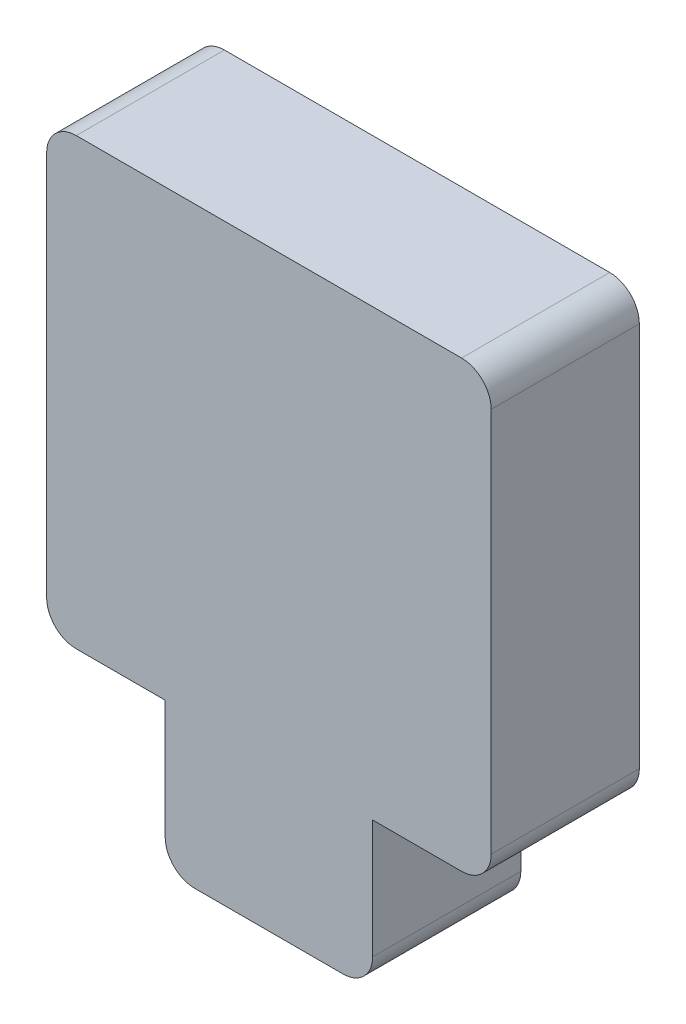
ISO-10303-21;
HEADER;
FILE_DESCRIPTION(('STEP AP214'),'2;1');
FILE_NAME('part.step','',(''),(''),'','','');
FILE_SCHEMA(('AUTOMOTIVE_DESIGN { 1 0 10303 214 1 1 1 1 }'));
ENDSEC;
DATA;
#1=APPLICATION_CONTEXT('core data for automotive mechanical design processes');
#2=APPLICATION_PROTOCOL_DEFINITION('international standard','automotive_design',2000,#1);
#3=PRODUCT_CONTEXT('',#1,'mechanical');
#4=PRODUCT('Part','Part','',(#3));
#5=PRODUCT_RELATED_PRODUCT_CATEGORY('part','',(#4));
#6=PRODUCT_DEFINITION_FORMATION('','',#4);
#7=PRODUCT_DEFINITION_CONTEXT('part definition',#1,'design');
#8=PRODUCT_DEFINITION('design','',#6,#7);
#9=PRODUCT_DEFINITION_SHAPE('','',#8);
#10=(LENGTH_UNIT() NAMED_UNIT(*) SI_UNIT(.MILLI.,.METRE.));
#11=(NAMED_UNIT(*) PLANE_ANGLE_UNIT() SI_UNIT($,.RADIAN.));
#12=(NAMED_UNIT(*) SI_UNIT($,.STERADIAN.) SOLID_ANGLE_UNIT());
#13=UNCERTAINTY_MEASURE_WITH_UNIT(LENGTH_MEASURE(1.E-05),#10,'distance_accuracy_value','');
#14=(GEOMETRIC_REPRESENTATION_CONTEXT(3) GLOBAL_UNCERTAINTY_ASSIGNED_CONTEXT((#13)) GLOBAL_UNIT_ASSIGNED_CONTEXT((#10,
#11,#12)) REPRESENTATION_CONTEXT('',''));
#15=CARTESIAN_POINT('',(0.,0.,0.));
#16=DIRECTION('',(0.,0.,1.));
#17=DIRECTION('',(1.,0.,0.));
#18=AXIS2_PLACEMENT_3D('',#15,#16,#17);
#19=CARTESIAN_POINT('',(-15.,30.,10.));
#20=DIRECTION('',(0.,1.,0.));
#21=DIRECTION('',(0.,0.,1.));
#22=AXIS2_PLACEMENT_3D('',#19,#20,#21);
#23=PLANE('',#22);
#24=DIRECTION('',(1.,0.,0.));
#25=VECTOR('',#24,1.);
#26=CARTESIAN_POINT('',(-15.,30.,10.));
#27=LINE('',#26,#25);
#28=CARTESIAN_POINT('',(-13.,30.,10.));
#29=VERTEX_POINT('',#28);
#30=CARTESIAN_POINT('',(13.,30.,10.));
#31=VERTEX_POINT('',#30);
#32=EDGE_CURVE('E227',#29,#31,#27,.T.);
#33=ORIENTED_EDGE('',*,*,#32,.T.);
#34=DIRECTION('',(0.,0.,-1.));
#35=VECTOR('',#34,1.);
#36=CARTESIAN_POINT('',(13.,30.,10.));
#37=LINE('',#36,#35);
#38=CARTESIAN_POINT('',(13.,30.,0.));
#39=VERTEX_POINT('',#38);
#40=EDGE_CURVE('E11',#31,#39,#37,.T.);
#41=ORIENTED_EDGE('',*,*,#40,.T.);
#42=DIRECTION('',(1.,0.,0.));
#43=VECTOR('',#42,1.);
#44=CARTESIAN_POINT('',(-15.,30.,0.));
#45=LINE('',#44,#43);
#46=CARTESIAN_POINT('',(-13.,30.,0.));
#47=VERTEX_POINT('',#46);
#48=EDGE_CURVE('E232',#47,#39,#45,.T.);
#49=ORIENTED_EDGE('',*,*,#48,.F.);
#50=DIRECTION('',(0.,0.,-1.));
#51=VECTOR('',#50,1.);
#52=CARTESIAN_POINT('',(-13.,30.,10.));
#53=LINE('',#52,#51);
#54=EDGE_CURVE('E50',#47,#29,#53,.F.);
#55=ORIENTED_EDGE('',*,*,#54,.T.);
#56=EDGE_LOOP('',(#33,#41,#49,#55));
#57=FACE_BOUND('',#56,.T.);
#58=ADVANCED_FACE('F39',(#57),#23,.T.);
#59=CARTESIAN_POINT('',(-15.,30.,10.));
#60=DIRECTION('',(1.,0.,0.));
#61=DIRECTION('',(0.,1.,0.));
#62=AXIS2_PLACEMENT_3D('',#59,#60,#61);
#63=PLANE('',#62);
#64=DIRECTION('',(0.,-1.,0.));
#65=VECTOR('',#64,1.);
#66=CARTESIAN_POINT('',(-15.,30.,0.));
#67=LINE('',#66,#65);
#68=CARTESIAN_POINT('',(-15.,28.,0.));
#69=VERTEX_POINT('',#68);
#70=CARTESIAN_POINT('',(-15.,2.,0.));
#71=VERTEX_POINT('',#70);
#72=EDGE_CURVE('E241',#69,#71,#67,.T.);
#73=ORIENTED_EDGE('',*,*,#72,.T.);
#74=DIRECTION('',(0.,0.,-1.));
#75=VECTOR('',#74,1.);
#76=CARTESIAN_POINT('',(-15.,2.,10.));
#77=LINE('',#76,#75);
#78=CARTESIAN_POINT('',(-15.,2.,10.));
#79=VERTEX_POINT('',#78);
#80=EDGE_CURVE('E53',#71,#79,#77,.F.);
#81=ORIENTED_EDGE('',*,*,#80,.T.);
#82=DIRECTION('',(0.,-1.,0.));
#83=VECTOR('',#82,1.);
#84=CARTESIAN_POINT('',(-15.,30.,10.));
#85=LINE('',#84,#83);
#86=CARTESIAN_POINT('',(-15.,28.,10.));
#87=VERTEX_POINT('',#86);
#88=EDGE_CURVE('E182',#87,#79,#85,.T.);
#89=ORIENTED_EDGE('',*,*,#88,.F.);
#90=DIRECTION('',(0.,0.,-1.));
#91=VECTOR('',#90,1.);
#92=CARTESIAN_POINT('',(-15.,28.,0.));
#93=LINE('',#92,#91);
#94=EDGE_CURVE('E212',#87,#69,#93,.T.);
#95=ORIENTED_EDGE('',*,*,#94,.T.);
#96=EDGE_LOOP('',(#73,#81,#89,#95));
#97=FACE_BOUND('',#96,.T.);
#98=ADVANCED_FACE('F238',(#97),#63,.F.);
#99=CARTESIAN_POINT('',(15.,30.,10.));
#100=DIRECTION('',(1.,0.,0.));
#101=DIRECTION('',(0.,1.,0.));
#102=AXIS2_PLACEMENT_3D('',#99,#100,#101);
#103=PLANE('',#102);
#104=DIRECTION('',(0.,-1.,0.));
#105=VECTOR('',#104,1.);
#106=CARTESIAN_POINT('',(15.,30.,10.));
#107=LINE('',#106,#105);
#108=CARTESIAN_POINT('',(15.,28.,10.));
#109=VERTEX_POINT('',#108);
#110=CARTESIAN_POINT('',(15.,2.,10.));
#111=VERTEX_POINT('',#110);
#112=EDGE_CURVE('E237',#109,#111,#107,.T.);
#113=ORIENTED_EDGE('',*,*,#112,.T.);
#114=DIRECTION('',(0.,0.,-1.));
#115=VECTOR('',#114,1.);
#116=CARTESIAN_POINT('',(15.,2.,0.));
#117=LINE('',#116,#115);
#118=CARTESIAN_POINT('',(15.,2.,0.));
#119=VERTEX_POINT('',#118);
#120=EDGE_CURVE('E219',#111,#119,#117,.T.);
#121=ORIENTED_EDGE('',*,*,#120,.T.);
#122=DIRECTION('',(0.,-1.,0.));
#123=VECTOR('',#122,1.);
#124=CARTESIAN_POINT('',(15.,30.,0.));
#125=LINE('',#124,#123);
#126=CARTESIAN_POINT('',(15.,28.,0.));
#127=VERTEX_POINT('',#126);
#128=EDGE_CURVE('E153',#127,#119,#125,.T.);
#129=ORIENTED_EDGE('',*,*,#128,.F.);
#130=DIRECTION('',(0.,0.,-1.));
#131=VECTOR('',#130,1.);
#132=CARTESIAN_POINT('',(15.,28.,10.));
#133=LINE('',#132,#131);
#134=EDGE_CURVE('E217',#127,#109,#133,.F.);
#135=ORIENTED_EDGE('',*,*,#134,.T.);
#136=EDGE_LOOP('',(#113,#121,#129,#135));
#137=FACE_BOUND('',#136,.T.);
#138=ADVANCED_FACE('F278',(#137),#103,.T.);
#139=CARTESIAN_POINT('',(0.,0.,0.));
#140=DIRECTION('',(0.,0.,-1.));
#141=DIRECTION('',(-1.,0.,0.));
#142=AXIS2_PLACEMENT_3D('',#139,#140,#141);
#143=PLANE('',#142);
#144=DIRECTION('',(0.,-1.,0.));
#145=VECTOR('',#144,1.);
#146=CARTESIAN_POINT('',(7.,0.,0.));
#147=LINE('',#146,#145);
#148=CARTESIAN_POINT('',(7.,0.,0.));
#149=VERTEX_POINT('',#148);
#150=CARTESIAN_POINT('',(7.,-8.,0.));
#151=VERTEX_POINT('',#150);
#152=EDGE_CURVE('E171',#149,#151,#147,.T.);
#153=ORIENTED_EDGE('',*,*,#152,.T.);
#154=CARTESIAN_POINT('',(5.,-8.,0.));
#155=DIRECTION('',(0.,0.,-1.));
#156=DIRECTION('',(-1.,0.,0.));
#157=AXIS2_PLACEMENT_3D('',#154,#155,#156);
#158=CIRCLE('',#157,2.);
#159=CARTESIAN_POINT('',(5.,-10.,0.));
#160=VERTEX_POINT('',#159);
#161=EDGE_CURVE('E194',#151,#160,#158,.T.);
#162=ORIENTED_EDGE('',*,*,#161,.T.);
#163=DIRECTION('',(1.,0.,0.));
#164=VECTOR('',#163,1.);
#165=CARTESIAN_POINT('',(-7.,-10.,0.));
#166=LINE('',#165,#164);
#167=CARTESIAN_POINT('',(-5.,-10.,0.));
#168=VERTEX_POINT('',#167);
#169=EDGE_CURVE('E177',#168,#160,#166,.T.);
#170=ORIENTED_EDGE('',*,*,#169,.F.);
#171=CARTESIAN_POINT('',(-5.,-8.,0.));
#172=DIRECTION('',(0.,0.,-1.));
#173=DIRECTION('',(-1.,0.,0.));
#174=AXIS2_PLACEMENT_3D('',#171,#172,#173);
#175=CIRCLE('',#174,2.);
#176=CARTESIAN_POINT('',(-7.,-8.,0.));
#177=VERTEX_POINT('',#176);
#178=EDGE_CURVE('E166',#168,#177,#175,.T.);
#179=ORIENTED_EDGE('',*,*,#178,.T.);
#180=DIRECTION('',(0.,-1.,0.));
#181=VECTOR('',#180,1.);
#182=CARTESIAN_POINT('',(-7.,0.,0.));
#183=LINE('',#182,#181);
#184=CARTESIAN_POINT('',(-7.,0.,0.));
#185=VERTEX_POINT('',#184);
#186=EDGE_CURVE('E157',#185,#177,#183,.T.);
#187=ORIENTED_EDGE('',*,*,#186,.F.);
#188=DIRECTION('',(1.,0.,0.));
#189=VECTOR('',#188,1.);
#190=CARTESIAN_POINT('',(-15.,0.,0.));
#191=LINE('',#190,#189);
#192=CARTESIAN_POINT('',(-13.,0.,0.));
#193=VERTEX_POINT('',#192);
#194=EDGE_CURVE('E141',#193,#185,#191,.T.);
#195=ORIENTED_EDGE('',*,*,#194,.F.);
#196=CARTESIAN_POINT('',(-13.,2.,0.));
#197=DIRECTION('',(0.,0.,-1.));
#198=DIRECTION('',(-1.,0.,0.));
#199=AXIS2_PLACEMENT_3D('',#196,#197,#198);
#200=CIRCLE('',#199,2.);
#201=EDGE_CURVE('E189',#193,#71,#200,.T.);
#202=ORIENTED_EDGE('',*,*,#201,.T.);
#203=ORIENTED_EDGE('',*,*,#72,.F.);
#204=CARTESIAN_POINT('',(-13.,28.,0.));
#205=DIRECTION('',(0.,0.,-1.));
#206=DIRECTION('',(-1.,0.,0.));
#207=AXIS2_PLACEMENT_3D('',#204,#205,#206);
#208=CIRCLE('',#207,2.);
#209=EDGE_CURVE('E184',#69,#47,#208,.T.);
#210=ORIENTED_EDGE('',*,*,#209,.T.);
#211=ORIENTED_EDGE('',*,*,#48,.T.);
#212=CARTESIAN_POINT('',(13.,28.,0.));
#213=DIRECTION('',(0.,0.,-1.));
#214=DIRECTION('',(-1.,0.,0.));
#215=AXIS2_PLACEMENT_3D('',#212,#213,#214);
#216=CIRCLE('',#215,2.);
#217=EDGE_CURVE('E186',#39,#127,#216,.T.);
#218=ORIENTED_EDGE('',*,*,#217,.T.);
#219=ORIENTED_EDGE('',*,*,#128,.T.);
#220=CARTESIAN_POINT('',(13.,2.,0.));
#221=DIRECTION('',(0.,0.,-1.));
#222=DIRECTION('',(-1.,0.,0.));
#223=AXIS2_PLACEMENT_3D('',#220,#221,#222);
#224=CIRCLE('',#223,2.);
#225=CARTESIAN_POINT('',(13.,0.,0.));
#226=VERTEX_POINT('',#225);
#227=EDGE_CURVE('E187',#119,#226,#224,.T.);
#228=ORIENTED_EDGE('',*,*,#227,.T.);
#229=EDGE_CURVE('E152',#149,#226,#191,.T.);
#230=ORIENTED_EDGE('',*,*,#229,.F.);
#231=EDGE_LOOP('',(#153,#162,#170,#179,#187,#195,#202,#203,#210,#211,#218,#219,#228,#230));
#232=FACE_BOUND('',#231,.T.);
#233=ADVANCED_FACE('F170',(#232),#143,.T.);
#234=CARTESIAN_POINT('',(0.,0.,10.));
#235=DIRECTION('',(0.,0.,-1.));
#236=DIRECTION('',(-1.,0.,0.));
#237=AXIS2_PLACEMENT_3D('',#234,#235,#236);
#238=PLANE('',#237);
#239=DIRECTION('',(1.,0.,0.));
#240=VECTOR('',#239,1.);
#241=CARTESIAN_POINT('',(-7.,-10.,10.));
#242=LINE('',#241,#240);
#243=CARTESIAN_POINT('',(-5.,-10.,10.));
#244=VERTEX_POINT('',#243);
#245=CARTESIAN_POINT('',(5.,-10.,10.));
#246=VERTEX_POINT('',#245);
#247=EDGE_CURVE('E168',#244,#246,#242,.T.);
#248=ORIENTED_EDGE('',*,*,#247,.T.);
#249=CARTESIAN_POINT('',(5.,-8.,10.));
#250=DIRECTION('',(0.,0.,-1.));
#251=DIRECTION('',(-1.,0.,0.));
#252=AXIS2_PLACEMENT_3D('',#249,#250,#251);
#253=CIRCLE('',#252,2.);
#254=CARTESIAN_POINT('',(7.,-8.,10.));
#255=VERTEX_POINT('',#254);
#256=EDGE_CURVE('E207',#246,#255,#253,.F.);
#257=ORIENTED_EDGE('',*,*,#256,.T.);
#258=DIRECTION('',(0.,-1.,0.));
#259=VECTOR('',#258,1.);
#260=CARTESIAN_POINT('',(7.,0.,10.));
#261=LINE('',#260,#259);
#262=CARTESIAN_POINT('',(7.,0.,10.));
#263=VERTEX_POINT('',#262);
#264=EDGE_CURVE('E173',#263,#255,#261,.T.);
#265=ORIENTED_EDGE('',*,*,#264,.F.);
#266=DIRECTION('',(1.,0.,0.));
#267=VECTOR('',#266,1.);
#268=CARTESIAN_POINT('',(-15.,0.,10.));
#269=LINE('',#268,#267);
#270=CARTESIAN_POINT('',(13.,0.,10.));
#271=VERTEX_POINT('',#270);
#272=EDGE_CURVE('E245',#263,#271,#269,.T.);
#273=ORIENTED_EDGE('',*,*,#272,.T.);
#274=CARTESIAN_POINT('',(13.,2.,10.));
#275=DIRECTION('',(0.,0.,-1.));
#276=DIRECTION('',(-1.,0.,0.));
#277=AXIS2_PLACEMENT_3D('',#274,#275,#276);
#278=CIRCLE('',#277,2.);
#279=EDGE_CURVE('E201',#271,#111,#278,.F.);
#280=ORIENTED_EDGE('',*,*,#279,.T.);
#281=ORIENTED_EDGE('',*,*,#112,.F.);
#282=CARTESIAN_POINT('',(13.,28.,10.));
#283=DIRECTION('',(0.,0.,-1.));
#284=DIRECTION('',(-1.,0.,0.));
#285=AXIS2_PLACEMENT_3D('',#282,#283,#284);
#286=CIRCLE('',#285,2.);
#287=EDGE_CURVE('E203',#109,#31,#286,.F.);
#288=ORIENTED_EDGE('',*,*,#287,.T.);
#289=ORIENTED_EDGE('',*,*,#32,.F.);
#290=CARTESIAN_POINT('',(-13.,28.,10.));
#291=DIRECTION('',(0.,0.,-1.));
#292=DIRECTION('',(-1.,0.,0.));
#293=AXIS2_PLACEMENT_3D('',#290,#291,#292);
#294=CIRCLE('',#293,2.);
#295=EDGE_CURVE('E61',#29,#87,#294,.F.);
#296=ORIENTED_EDGE('',*,*,#295,.T.);
#297=ORIENTED_EDGE('',*,*,#88,.T.);
#298=CARTESIAN_POINT('',(-13.,2.,10.));
#299=DIRECTION('',(0.,0.,-1.));
#300=DIRECTION('',(-1.,0.,0.));
#301=AXIS2_PLACEMENT_3D('',#298,#299,#300);
#302=CIRCLE('',#301,2.);
#303=CARTESIAN_POINT('',(-13.,0.,10.));
#304=VERTEX_POINT('',#303);
#305=EDGE_CURVE('E202',#79,#304,#302,.F.);
#306=ORIENTED_EDGE('',*,*,#305,.T.);
#307=CARTESIAN_POINT('',(-7.,0.,10.));
#308=VERTEX_POINT('',#307);
#309=EDGE_CURVE('E244',#304,#308,#269,.T.);
#310=ORIENTED_EDGE('',*,*,#309,.T.);
#311=DIRECTION('',(0.,-1.,0.));
#312=VECTOR('',#311,1.);
#313=CARTESIAN_POINT('',(-7.,0.,10.));
#314=LINE('',#313,#312);
#315=CARTESIAN_POINT('',(-7.,-8.,10.));
#316=VERTEX_POINT('',#315);
#317=EDGE_CURVE('E165',#308,#316,#314,.T.);
#318=ORIENTED_EDGE('',*,*,#317,.T.);
#319=CARTESIAN_POINT('',(-5.,-8.,10.));
#320=DIRECTION('',(0.,0.,-1.));
#321=DIRECTION('',(-1.,0.,0.));
#322=AXIS2_PLACEMENT_3D('',#319,#320,#321);
#323=CIRCLE('',#322,2.);
#324=EDGE_CURVE('E210',#316,#244,#323,.F.);
#325=ORIENTED_EDGE('',*,*,#324,.T.);
#326=EDGE_LOOP('',(#248,#257,#265,#273,#280,#281,#288,#289,#296,#297,#306,#310,#318,#325));
#327=FACE_BOUND('',#326,.T.);
#328=ADVANCED_FACE('F234',(#327),#238,.F.);
#329=CARTESIAN_POINT('',(-15.,0.,10.));
#330=DIRECTION('',(0.,1.,0.));
#331=DIRECTION('',(0.,0.,1.));
#332=AXIS2_PLACEMENT_3D('',#329,#330,#331);
#333=PLANE('',#332);
#334=ORIENTED_EDGE('',*,*,#229,.T.);
#335=DIRECTION('',(0.,0.,-1.));
#336=VECTOR('',#335,1.);
#337=CARTESIAN_POINT('',(13.,0.,10.));
#338=LINE('',#337,#336);
#339=EDGE_CURVE('E224',#226,#271,#338,.F.);
#340=ORIENTED_EDGE('',*,*,#339,.T.);
#341=ORIENTED_EDGE('',*,*,#272,.F.);
#342=DIRECTION('',(0.,0.,-1.));
#343=VECTOR('',#342,1.);
#344=CARTESIAN_POINT('',(7.,0.,10.));
#345=LINE('',#344,#343);
#346=EDGE_CURVE('E163',#263,#149,#345,.T.);
#347=ORIENTED_EDGE('',*,*,#346,.T.);
#348=EDGE_LOOP('',(#334,#340,#341,#347));
#349=FACE_BOUND('',#348,.T.);
#350=ADVANCED_FACE('F269',(#349),#333,.F.);
#351=ORIENTED_EDGE('',*,*,#309,.F.);
#352=DIRECTION('',(0.,0.,-1.));
#353=VECTOR('',#352,1.);
#354=CARTESIAN_POINT('',(-13.,0.,10.));
#355=LINE('',#354,#353);
#356=EDGE_CURVE('E147',#304,#193,#355,.T.);
#357=ORIENTED_EDGE('',*,*,#356,.T.);
#358=ORIENTED_EDGE('',*,*,#194,.T.);
#359=DIRECTION('',(0.,0.,-1.));
#360=VECTOR('',#359,1.);
#361=CARTESIAN_POINT('',(-7.,0.,10.));
#362=LINE('',#361,#360);
#363=EDGE_CURVE('E150',#308,#185,#362,.T.);
#364=ORIENTED_EDGE('',*,*,#363,.F.);
#365=EDGE_LOOP('',(#351,#357,#358,#364));
#366=FACE_BOUND('',#365,.T.);
#367=ADVANCED_FACE('F148',(#366),#333,.F.);
#368=CARTESIAN_POINT('',(-7.,-10.,10.));
#369=DIRECTION('',(0.,1.,0.));
#370=DIRECTION('',(-1.,0.,0.));
#371=AXIS2_PLACEMENT_3D('',#368,#369,#370);
#372=PLANE('',#371);
#373=ORIENTED_EDGE('',*,*,#169,.T.);
#374=DIRECTION('',(0.,0.,-1.));
#375=VECTOR('',#374,1.);
#376=CARTESIAN_POINT('',(5.,-10.,10.));
#377=LINE('',#376,#375);
#378=EDGE_CURVE('E196',#160,#246,#377,.F.);
#379=ORIENTED_EDGE('',*,*,#378,.T.);
#380=ORIENTED_EDGE('',*,*,#247,.F.);
#381=DIRECTION('',(0.,0.,-1.));
#382=VECTOR('',#381,1.);
#383=CARTESIAN_POINT('',(-5.,-10.,10.));
#384=LINE('',#383,#382);
#385=EDGE_CURVE('E193',#244,#168,#384,.T.);
#386=ORIENTED_EDGE('',*,*,#385,.T.);
#387=EDGE_LOOP('',(#373,#379,#380,#386));
#388=FACE_BOUND('',#387,.T.);
#389=ADVANCED_FACE('F254',(#388),#372,.F.);
#390=CARTESIAN_POINT('',(7.,0.,10.));
#391=DIRECTION('',(1.,0.,0.));
#392=DIRECTION('',(0.,1.,0.));
#393=AXIS2_PLACEMENT_3D('',#390,#391,#392);
#394=PLANE('',#393);
#395=ORIENTED_EDGE('',*,*,#264,.T.);
#396=DIRECTION('',(0.,0.,-1.));
#397=VECTOR('',#396,1.);
#398=CARTESIAN_POINT('',(7.,-8.,0.));
#399=LINE('',#398,#397);
#400=EDGE_CURVE('E162',#255,#151,#399,.T.);
#401=ORIENTED_EDGE('',*,*,#400,.T.);
#402=ORIENTED_EDGE('',*,*,#152,.F.);
#403=ORIENTED_EDGE('',*,*,#346,.F.);
#404=EDGE_LOOP('',(#395,#401,#402,#403));
#405=FACE_BOUND('',#404,.T.);
#406=ADVANCED_FACE('F264',(#405),#394,.T.);
#407=CARTESIAN_POINT('',(-7.,0.,10.));
#408=DIRECTION('',(1.,0.,0.));
#409=DIRECTION('',(0.,1.,0.));
#410=AXIS2_PLACEMENT_3D('',#407,#408,#409);
#411=PLANE('',#410);
#412=ORIENTED_EDGE('',*,*,#186,.T.);
#413=DIRECTION('',(0.,0.,-1.));
#414=VECTOR('',#413,1.);
#415=CARTESIAN_POINT('',(-7.,-8.,10.));
#416=LINE('',#415,#414);
#417=EDGE_CURVE('E211',#177,#316,#416,.F.);
#418=ORIENTED_EDGE('',*,*,#417,.T.);
#419=ORIENTED_EDGE('',*,*,#317,.F.);
#420=ORIENTED_EDGE('',*,*,#363,.T.);
#421=EDGE_LOOP('',(#412,#418,#419,#420));
#422=FACE_BOUND('',#421,.T.);
#423=ADVANCED_FACE('F158',(#422),#411,.F.);
#424=CARTESIAN_POINT('',(5.,-8.,10.));
#425=DIRECTION('',(0.,0.,1.));
#426=DIRECTION('',(1.,0.,0.));
#427=AXIS2_PLACEMENT_3D('',#424,#425,#426);
#428=CYLINDRICAL_SURFACE('',#427,2.);
#429=ORIENTED_EDGE('',*,*,#256,.F.);
#430=ORIENTED_EDGE('',*,*,#378,.F.);
#431=ORIENTED_EDGE('',*,*,#161,.F.);
#432=ORIENTED_EDGE('',*,*,#400,.F.);
#433=EDGE_LOOP('',(#429,#430,#431,#432));
#434=FACE_BOUND('',#433,.T.);
#435=ADVANCED_FACE('F257',(#434),#428,.T.);
#436=CARTESIAN_POINT('',(-5.,-8.,10.));
#437=DIRECTION('',(0.,0.,-1.));
#438=DIRECTION('',(-1.,0.,0.));
#439=AXIS2_PLACEMENT_3D('',#436,#437,#438);
#440=CYLINDRICAL_SURFACE('',#439,2.);
#441=ORIENTED_EDGE('',*,*,#324,.F.);
#442=ORIENTED_EDGE('',*,*,#417,.F.);
#443=ORIENTED_EDGE('',*,*,#178,.F.);
#444=ORIENTED_EDGE('',*,*,#385,.F.);
#445=EDGE_LOOP('',(#441,#442,#443,#444));
#446=FACE_BOUND('',#445,.T.);
#447=ADVANCED_FACE('F286',(#446),#440,.T.);
#448=CARTESIAN_POINT('',(-13.,2.,10.));
#449=DIRECTION('',(0.,0.,-1.));
#450=DIRECTION('',(-1.,0.,0.));
#451=AXIS2_PLACEMENT_3D('',#448,#449,#450);
#452=CYLINDRICAL_SURFACE('',#451,2.);
#453=ORIENTED_EDGE('',*,*,#305,.F.);
#454=ORIENTED_EDGE('',*,*,#80,.F.);
#455=ORIENTED_EDGE('',*,*,#201,.F.);
#456=ORIENTED_EDGE('',*,*,#356,.F.);
#457=EDGE_LOOP('',(#453,#454,#455,#456));
#458=FACE_BOUND('',#457,.T.);
#459=ADVANCED_FACE('F290',(#458),#452,.T.);
#460=CARTESIAN_POINT('',(13.,2.,10.));
#461=DIRECTION('',(0.,0.,1.));
#462=DIRECTION('',(1.,0.,0.));
#463=AXIS2_PLACEMENT_3D('',#460,#461,#462);
#464=CYLINDRICAL_SURFACE('',#463,2.);
#465=ORIENTED_EDGE('',*,*,#279,.F.);
#466=ORIENTED_EDGE('',*,*,#339,.F.);
#467=ORIENTED_EDGE('',*,*,#227,.F.);
#468=ORIENTED_EDGE('',*,*,#120,.F.);
#469=EDGE_LOOP('',(#465,#466,#467,#468));
#470=FACE_BOUND('',#469,.T.);
#471=ADVANCED_FACE('F277',(#470),#464,.T.);
#472=CARTESIAN_POINT('',(13.,28.,10.));
#473=DIRECTION('',(0.,0.,-1.));
#474=DIRECTION('',(-1.,0.,0.));
#475=AXIS2_PLACEMENT_3D('',#472,#473,#474);
#476=CYLINDRICAL_SURFACE('',#475,2.);
#477=ORIENTED_EDGE('',*,*,#287,.F.);
#478=ORIENTED_EDGE('',*,*,#134,.F.);
#479=ORIENTED_EDGE('',*,*,#217,.F.);
#480=ORIENTED_EDGE('',*,*,#40,.F.);
#481=EDGE_LOOP('',(#477,#478,#479,#480));
#482=FACE_BOUND('',#481,.T.);
#483=ADVANCED_FACE('F293',(#482),#476,.T.);
#484=CARTESIAN_POINT('',(-13.,28.,10.));
#485=DIRECTION('',(0.,0.,1.));
#486=DIRECTION('',(1.,0.,0.));
#487=AXIS2_PLACEMENT_3D('',#484,#485,#486);
#488=CYLINDRICAL_SURFACE('',#487,2.);
#489=ORIENTED_EDGE('',*,*,#295,.F.);
#490=ORIENTED_EDGE('',*,*,#54,.F.);
#491=ORIENTED_EDGE('',*,*,#209,.F.);
#492=ORIENTED_EDGE('',*,*,#94,.F.);
#493=EDGE_LOOP('',(#489,#490,#491,#492));
#494=FACE_BOUND('',#493,.T.);
#495=ADVANCED_FACE('F41',(#494),#488,.T.);
#496=CLOSED_SHELL('',(#58,#98,#138,#233,#328,#350,#367,#389,#406,#423,#435,#447,#459,#471,#483,#495));
#497=MANIFOLD_SOLID_BREP('B2',#496);
#498=ADVANCED_BREP_SHAPE_REPRESENTATION('',(#18,#497),#14);
#499=SHAPE_DEFINITION_REPRESENTATION(#9,#498);
ENDSEC;
END-ISO-10303-21;
